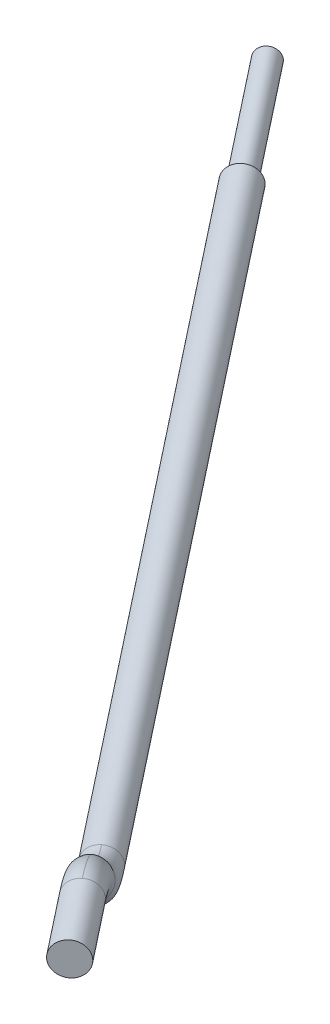
ISO-10303-21;
HEADER;
FILE_DESCRIPTION(('STEP AP214'),'2;1');
FILE_NAME('part.step','',(''),(''),'','','');
FILE_SCHEMA(('AUTOMOTIVE_DESIGN { 1 0 10303 214 1 1 1 1 }'));
ENDSEC;
DATA;
#1=APPLICATION_CONTEXT('core data for automotive mechanical design processes');
#2=APPLICATION_PROTOCOL_DEFINITION('international standard','automotive_design',2000,#1);
#3=PRODUCT_CONTEXT('',#1,'mechanical');
#4=PRODUCT('Part','Part','',(#3));
#5=PRODUCT_RELATED_PRODUCT_CATEGORY('part','',(#4));
#6=PRODUCT_DEFINITION_FORMATION('','',#4);
#7=PRODUCT_DEFINITION_CONTEXT('part definition',#1,'design');
#8=PRODUCT_DEFINITION('design','',#6,#7);
#9=PRODUCT_DEFINITION_SHAPE('','',#8);
#10=(LENGTH_UNIT() NAMED_UNIT(*) SI_UNIT(.MILLI.,.METRE.));
#11=(NAMED_UNIT(*) PLANE_ANGLE_UNIT() SI_UNIT($,.RADIAN.));
#12=(NAMED_UNIT(*) SI_UNIT($,.STERADIAN.) SOLID_ANGLE_UNIT());
#13=UNCERTAINTY_MEASURE_WITH_UNIT(LENGTH_MEASURE(1.E-05),#10,'distance_accuracy_value','');
#14=(GEOMETRIC_REPRESENTATION_CONTEXT(3) GLOBAL_UNCERTAINTY_ASSIGNED_CONTEXT((#13)) GLOBAL_UNIT_ASSIGNED_CONTEXT((#10,
#11,#12)) REPRESENTATION_CONTEXT('',''));
#15=CARTESIAN_POINT('',(0.,0.,0.));
#16=DIRECTION('',(0.,0.,1.));
#17=DIRECTION('',(1.,0.,0.));
#18=AXIS2_PLACEMENT_3D('',#15,#16,#17);
#19=CARTESIAN_POINT('',(111.992586777966,24.2617264619024,218.0470998851));
#20=DIRECTION('',(-0.618589574131749,0.,-0.78571428571428));
#21=DIRECTION('',(0.,1.,0.));
#22=AXIS2_PLACEMENT_3D('',#19,#20,#21);
#23=PLANE('',#22);
#24=CARTESIAN_POINT('',(111.992586777966,24.2617264619024,218.0470998851));
#25=DIRECTION('',(-0.618589574131749,0.,-0.78571428571428));
#26=DIRECTION('',(-0.78571428571428,0.,0.618589574131749));
#27=AXIS2_PLACEMENT_3D('',#24,#25,#26);
#28=CIRCLE('',#27,0.5715);
#29=CARTESIAN_POINT('',(112.441622492252,24.2617264619024,217.693575943483));
#30=VERTEX_POINT('',#29);
#31=CARTESIAN_POINT('',(111.54355106368,24.2617264619024,218.400623826716));
#32=VERTEX_POINT('',#31);
#33=EDGE_CURVE('E11',#30,#32,#28,.T.);
#34=ORIENTED_EDGE('',*,*,#33,.T.);
#35=CARTESIAN_POINT('',(111.992586777966,24.2617264619024,218.0470998851));
#36=DIRECTION('',(-0.618589574131749,0.,-0.78571428571428));
#37=DIRECTION('',(-0.78571428571428,0.,0.618589574131749));
#38=AXIS2_PLACEMENT_3D('',#35,#36,#37);
#39=CIRCLE('',#38,0.5715);
#40=EDGE_CURVE('E158',#32,#30,#39,.T.);
#41=ORIENTED_EDGE('',*,*,#40,.T.);
#42=EDGE_LOOP('',(#34,#41));
#43=FACE_BOUND('',#42,.T.);
#44=ADVANCED_FACE('F42',(#43),#23,.T.);
#45=CARTESIAN_POINT('',(111.992586777966,24.2617264619024,218.0470998851));
#46=DIRECTION('',(0.618589574131749,0.,0.78571428571428));
#47=DIRECTION('',(0.78571428571428,0.,-0.618589574131749));
#48=AXIS2_PLACEMENT_3D('',#45,#46,#47);
#49=CYLINDRICAL_SURFACE('',#48,0.5715);
#50=DIRECTION('',(0.618589574131749,0.,0.78571428571428));
#51=VECTOR('',#50,1.);
#52=CARTESIAN_POINT('',(111.54355106368,24.2617264619024,218.400623826716));
#53=LINE('',#52,#51);
#54=CARTESIAN_POINT('',(116.257203618564,24.2617264619024,224.387766683859));
#55=VERTEX_POINT('',#54);
#56=EDGE_CURVE('E152',#32,#55,#53,.T.);
#57=ORIENTED_EDGE('',*,*,#56,.F.);
#58=ORIENTED_EDGE('',*,*,#33,.F.);
#59=DIRECTION('',(0.618589574131749,0.,0.78571428571428));
#60=VECTOR('',#59,1.);
#61=CARTESIAN_POINT('',(112.441622492252,24.2617264619024,217.693575943483));
#62=LINE('',#61,#60);
#63=CARTESIAN_POINT('',(117.155275047136,24.2617264619024,223.680718800626));
#64=VERTEX_POINT('',#63);
#65=EDGE_CURVE('E143',#30,#64,#62,.T.);
#66=ORIENTED_EDGE('',*,*,#65,.T.);
#67=CARTESIAN_POINT('',(116.70623933285,24.2617264619024,224.034242742243));
#68=DIRECTION('',(-0.618589574131749,0.,-0.78571428571428));
#69=DIRECTION('',(-0.78571428571428,0.,0.618589574131749));
#70=AXIS2_PLACEMENT_3D('',#67,#68,#69);
#71=CIRCLE('',#70,0.5715);
#72=EDGE_CURVE('E53',#64,#55,#71,.T.);
#73=ORIENTED_EDGE('',*,*,#72,.T.);
#74=EDGE_LOOP('',(#57,#58,#66,#73));
#75=FACE_BOUND('',#74,.T.);
#76=ADVANCED_FACE('F144',(#75),#49,.T.);
#77=CARTESIAN_POINT('',(148.680515830146,26.8453,264.647028456528));
#78=DIRECTION('',(-0.618589574131749,0.,-0.78571428571428));
#79=DIRECTION('',(0.,1.,0.));
#80=AXIS2_PLACEMENT_3D('',#77,#78,#79);
#81=PLANE('',#80);
#82=CARTESIAN_POINT('',(148.680515830146,26.8453,264.647028456528));
#83=DIRECTION('',(-0.618589574131749,0.,-0.78571428571428));
#84=DIRECTION('',(-0.78571428571428,0.,0.618589574131749));
#85=AXIS2_PLACEMENT_3D('',#82,#83,#84);
#86=CIRCLE('',#85,0.8255);
#87=CARTESIAN_POINT('',(148.031908687289,26.8453,265.157674149974));
#88=VERTEX_POINT('',#87);
#89=CARTESIAN_POINT('',(149.329122973003,26.8453,264.136382763082));
#90=VERTEX_POINT('',#89);
#91=EDGE_CURVE('E233',#88,#90,#86,.T.);
#92=ORIENTED_EDGE('',*,*,#91,.F.);
#93=CARTESIAN_POINT('',(148.680515830146,26.8453,264.647028456528));
#94=DIRECTION('',(-0.618589574131749,0.,-0.78571428571428));
#95=DIRECTION('',(-0.78571428571428,0.,0.618589574131749));
#96=AXIS2_PLACEMENT_3D('',#93,#94,#95);
#97=CIRCLE('',#96,0.8255);
#98=EDGE_CURVE('E140',#90,#88,#97,.T.);
#99=ORIENTED_EDGE('',*,*,#98,.F.);
#100=EDGE_LOOP('',(#92,#99));
#101=FACE_BOUND('',#100,.T.);
#102=ADVANCED_FACE('F256',(#101),#81,.F.);
#103=CARTESIAN_POINT('',(116.70623933285,24.2617264619024,224.034242742243));
#104=DIRECTION('',(-0.618589574131749,0.,-0.78571428571428));
#105=DIRECTION('',(0.,1.,0.));
#106=AXIS2_PLACEMENT_3D('',#103,#104,#105);
#107=PLANE('',#106);
#108=ORIENTED_EDGE('',*,*,#72,.F.);
#109=CARTESIAN_POINT('',(116.70623933285,24.2617264619024,224.034242742243));
#110=DIRECTION('',(-0.618589574131749,0.,-0.78571428571428));
#111=DIRECTION('',(-0.78571428571428,0.,0.618589574131749));
#112=AXIS2_PLACEMENT_3D('',#109,#110,#111);
#113=CIRCLE('',#112,0.5715);
#114=EDGE_CURVE('E135',#55,#64,#113,.T.);
#115=ORIENTED_EDGE('',*,*,#114,.F.);
#116=EDGE_LOOP('',(#108,#115));
#117=FACE_BOUND('',#116,.T.);
#118=CARTESIAN_POINT('',(116.70623933285,24.2617264619024,224.034242742243));
#119=DIRECTION('',(-0.618589574131749,0.,-0.78571428571428));
#120=DIRECTION('',(-0.78571428571428,0.,0.618589574131749));
#121=AXIS2_PLACEMENT_3D('',#118,#119,#120);
#122=CIRCLE('',#121,0.8255);
#123=CARTESIAN_POINT('',(116.057632189993,24.2617264619024,224.544888435688));
#124=VERTEX_POINT('',#123);
#125=CARTESIAN_POINT('',(117.354846475707,24.2617264619024,223.523597048797));
#126=VERTEX_POINT('',#125);
#127=EDGE_CURVE('E167',#124,#126,#122,.T.);
#128=ORIENTED_EDGE('',*,*,#127,.T.);
#129=CARTESIAN_POINT('',(116.70623933285,24.2617264619024,224.034242742243));
#130=DIRECTION('',(-0.618589574131749,0.,-0.78571428571428));
#131=DIRECTION('',(-0.78571428571428,0.,0.618589574131749));
#132=AXIS2_PLACEMENT_3D('',#129,#130,#131);
#133=CIRCLE('',#132,0.8255);
#134=EDGE_CURVE('E203',#126,#124,#133,.T.);
#135=ORIENTED_EDGE('',*,*,#134,.T.);
#136=EDGE_LOOP('',(#128,#135));
#137=FACE_BOUND('',#136,.T.);
#138=ADVANCED_FACE('F132',(#117,#137),#107,.T.);
#139=CARTESIAN_POINT('',(148.680515830146,26.8453,264.647028456528));
#140=DIRECTION('',(-0.618589574131749,0.,-0.78571428571428));
#141=DIRECTION('',(-0.78571428571428,0.,0.618589574131749));
#142=AXIS2_PLACEMENT_3D('',#139,#140,#141);
#143=CYLINDRICAL_SURFACE('',#142,0.8255);
#144=DIRECTION('',(-0.618589574131749,0.,-0.78571428571428));
#145=VECTOR('',#144,1.);
#146=CARTESIAN_POINT('',(149.329122973003,26.8453,264.136382763082));
#147=LINE('',#146,#145);
#148=CARTESIAN_POINT('',(146.972296695561,26.8453,261.142811334511));
#149=VERTEX_POINT('',#148);
#150=EDGE_CURVE('E46',#90,#149,#147,.T.);
#151=ORIENTED_EDGE('',*,*,#150,.F.);
#152=ORIENTED_EDGE('',*,*,#98,.T.);
#153=DIRECTION('',(-0.618589574131749,0.,-0.78571428571428));
#154=VECTOR('',#153,1.);
#155=CARTESIAN_POINT('',(148.031908687289,26.8453,265.157674149974));
#156=LINE('',#155,#154);
#157=CARTESIAN_POINT('',(145.675082409847,26.8453,262.164102721402));
#158=VERTEX_POINT('',#157);
#159=EDGE_CURVE('E169',#88,#158,#156,.T.);
#160=ORIENTED_EDGE('',*,*,#159,.T.);
#161=CARTESIAN_POINT('',(146.323689552704,26.8453,261.653457027957));
#162=DIRECTION('',(-0.618589574131749,0.,-0.78571428571428));
#163=DIRECTION('',(-0.78571428571428,0.,0.618589574131749));
#164=AXIS2_PLACEMENT_3D('',#161,#162,#163);
#165=CIRCLE('',#164,0.8255);
#166=CARTESIAN_POINT('',(146.323689552704,26.0198,261.653457027957));
#167=VERTEX_POINT('',#166);
#168=EDGE_CURVE('E236',#167,#158,#165,.T.);
#169=ORIENTED_EDGE('',*,*,#168,.F.);
#170=CARTESIAN_POINT('',(146.323689552704,26.8453,261.653457027957));
#171=DIRECTION('',(-0.618589574131749,0.,-0.78571428571428));
#172=DIRECTION('',(-0.78571428571428,0.,0.618589574131749));
#173=AXIS2_PLACEMENT_3D('',#170,#171,#172);
#174=CIRCLE('',#173,0.8255);
#175=EDGE_CURVE('E65',#149,#167,#174,.T.);
#176=ORIENTED_EDGE('',*,*,#175,.F.);
#177=EDGE_LOOP('',(#151,#152,#160,#169,#176));
#178=FACE_BOUND('',#177,.T.);
#179=ADVANCED_FACE('F254',(#178),#143,.T.);
#180=CARTESIAN_POINT('',(146.323689552704,22.9893217548211,261.653457027957));
#181=DIRECTION('',(-0.78571428571428,0.,0.618589574131749));
#182=DIRECTION('',(0.618589574131749,0.,0.78571428571428));
#183=AXIS2_PLACEMENT_3D('',#180,#181,#182);
#184=TOROIDAL_SURFACE('',#183,3.85597824517889,0.8255);
#185=CARTESIAN_POINT('',(146.323689552704,22.9893217548211,261.653457027957));
#186=DIRECTION('',(-0.78571428571428,0.,0.618589574131749));
#187=DIRECTION('',(0.618589574131749,0.,0.78571428571428));
#188=AXIS2_PLACEMENT_3D('',#185,#186,#187);
#189=CIRCLE('',#188,4.68147824517889);
#190=CARTESIAN_POINT('',(146.323689552704,27.6708,261.653457027957));
#191=VERTEX_POINT('',#190);
#192=CARTESIAN_POINT('',(144.1608729183,26.1024634399395,258.906310942579));
#193=VERTEX_POINT('',#192);
#194=EDGE_CURVE('E188',#191,#193,#189,.T.);
#195=ORIENTED_EDGE('',*,*,#194,.F.);
#196=CARTESIAN_POINT('',(146.323689552704,26.8453,261.653457027957));
#197=DIRECTION('',(-0.618589574131749,0.,-0.78571428571428));
#198=DIRECTION('',(-0.78571428571428,0.,0.618589574131749));
#199=AXIS2_PLACEMENT_3D('',#196,#197,#198);
#200=CIRCLE('',#199,0.8255);
#201=EDGE_CURVE('E173',#191,#149,#200,.T.);
#202=ORIENTED_EDGE('',*,*,#201,.T.);
#203=ORIENTED_EDGE('',*,*,#175,.T.);
#204=CARTESIAN_POINT('',(146.323689552704,22.9893217548211,261.653457027957));
#205=DIRECTION('',(-0.78571428571428,0.,0.618589574131749));
#206=DIRECTION('',(0.618589574131749,0.,0.78571428571428));
#207=AXIS2_PLACEMENT_3D('',#204,#205,#206);
#208=CIRCLE('',#207,3.03047824517889);
#209=CARTESIAN_POINT('',(144.923625637931,25.0045630219629,259.875137016187));
#210=VERTEX_POINT('',#209);
#211=EDGE_CURVE('E240',#167,#210,#208,.T.);
#212=ORIENTED_EDGE('',*,*,#211,.T.);
#213=CARTESIAN_POINT('',(144.542249278115,25.5535132309512,259.390723979383));
#214=DIRECTION('',(-0.411356603267868,-0.746851221326742,-0.522493060385184));
#215=DIRECTION('',(-0.78571428571428,0.,0.618589574131749));
#216=AXIS2_PLACEMENT_3D('',#213,#214,#215);
#217=CIRCLE('',#216,0.8255);
#218=EDGE_CURVE('E227',#193,#210,#217,.T.);
#219=ORIENTED_EDGE('',*,*,#218,.F.);
#220=EDGE_LOOP('',(#195,#202,#203,#212,#219));
#221=FACE_BOUND('',#220,.T.);
#222=ADVANCED_FACE('F274',(#221),#184,.T.);
#223=CARTESIAN_POINT('',(142.760809003527,28.1177047070813,257.127990930809));
#224=DIRECTION('',(0.78571428571428,0.,-0.618589574131749));
#225=DIRECTION('',(-0.618589574131749,0.,-0.78571428571428));
#226=AXIS2_PLACEMENT_3D('',#223,#224,#225);
#227=TOROIDAL_SURFACE('',#226,3.85597824517889,0.8255);
#228=CARTESIAN_POINT('',(142.760809003527,28.1177047070813,257.127990930809));
#229=DIRECTION('',(0.78571428571428,0.,-0.618589574131749));
#230=DIRECTION('',(-0.618589574131749,0.,-0.78571428571428));
#231=AXIS2_PLACEMENT_3D('',#228,#229,#230);
#232=CIRCLE('',#231,4.68147824517889);
#233=CARTESIAN_POINT('',(142.760809003527,23.4362264619024,257.127990930809));
#234=VERTEX_POINT('',#233);
#235=EDGE_CURVE('E200',#210,#234,#232,.T.);
#236=ORIENTED_EDGE('',*,*,#235,.F.);
#237=CARTESIAN_POINT('',(144.542249278115,25.5535132309512,259.390723979383));
#238=DIRECTION('',(-0.411356603267868,-0.746851221326742,-0.522493060385184));
#239=DIRECTION('',(-0.78571428571428,0.,0.618589574131749));
#240=AXIS2_PLACEMENT_3D('',#237,#238,#239);
#241=CIRCLE('',#240,0.8255);
#242=EDGE_CURVE('E161',#210,#193,#241,.T.);
#243=ORIENTED_EDGE('',*,*,#242,.T.);
#244=CARTESIAN_POINT('',(142.760809003527,28.1177047070813,257.127990930809));
#245=DIRECTION('',(0.78571428571428,0.,-0.618589574131749));
#246=DIRECTION('',(-0.618589574131749,0.,-0.78571428571428));
#247=AXIS2_PLACEMENT_3D('',#244,#245,#246);
#248=CIRCLE('',#247,3.03047824517889);
#249=CARTESIAN_POINT('',(142.760809003527,25.0872264619024,257.127990930809));
#250=VERTEX_POINT('',#249);
#251=EDGE_CURVE('E175',#193,#250,#248,.T.);
#252=ORIENTED_EDGE('',*,*,#251,.T.);
#253=CARTESIAN_POINT('',(142.760809003527,24.2617264619024,257.127990930809));
#254=DIRECTION('',(-0.618589574131749,0.,-0.78571428571428));
#255=DIRECTION('',(-0.78571428571428,0.,0.618589574131749));
#256=AXIS2_PLACEMENT_3D('',#253,#254,#255);
#257=CIRCLE('',#256,0.8255);
#258=CARTESIAN_POINT('',(142.11220186067,24.2617264619024,257.638636624255));
#259=VERTEX_POINT('',#258);
#260=EDGE_CURVE('E149',#259,#250,#257,.T.);
#261=ORIENTED_EDGE('',*,*,#260,.F.);
#262=CARTESIAN_POINT('',(142.760809003527,24.2617264619024,257.127990930809));
#263=DIRECTION('',(-0.618589574131749,0.,-0.78571428571428));
#264=DIRECTION('',(-0.78571428571428,0.,0.618589574131749));
#265=AXIS2_PLACEMENT_3D('',#262,#263,#264);
#266=CIRCLE('',#265,0.8255);
#267=EDGE_CURVE('E172',#234,#259,#266,.T.);
#268=ORIENTED_EDGE('',*,*,#267,.F.);
#269=EDGE_LOOP('',(#236,#243,#252,#261,#268));
#270=FACE_BOUND('',#269,.T.);
#271=ADVANCED_FACE('F271',(#270),#227,.T.);
#272=CARTESIAN_POINT('',(142.760809003527,24.2617264619024,257.127990930809));
#273=DIRECTION('',(-0.618589574131749,0.,-0.78571428571428));
#274=DIRECTION('',(-0.78571428571428,0.,0.618589574131749));
#275=AXIS2_PLACEMENT_3D('',#272,#273,#274);
#276=CYLINDRICAL_SURFACE('',#275,0.8255);
#277=DIRECTION('',(-0.618589574131749,0.,-0.78571428571428));
#278=VECTOR('',#277,1.);
#279=CARTESIAN_POINT('',(143.409416146384,24.2617264619024,256.617345237363));
#280=LINE('',#279,#278);
#281=CARTESIAN_POINT('',(143.409416146384,24.2617264619024,256.617345237363));
#282=VERTEX_POINT('',#281);
#283=EDGE_CURVE('E164',#282,#126,#280,.T.);
#284=ORIENTED_EDGE('',*,*,#283,.F.);
#285=CARTESIAN_POINT('',(142.760809003527,24.2617264619024,257.127990930809));
#286=DIRECTION('',(-0.618589574131749,0.,-0.78571428571428));
#287=DIRECTION('',(-0.78571428571428,0.,0.618589574131749));
#288=AXIS2_PLACEMENT_3D('',#285,#286,#287);
#289=CIRCLE('',#288,0.8255);
#290=EDGE_CURVE('E192',#282,#234,#289,.T.);
#291=ORIENTED_EDGE('',*,*,#290,.T.);
#292=ORIENTED_EDGE('',*,*,#267,.T.);
#293=DIRECTION('',(-0.618589574131749,0.,-0.78571428571428));
#294=VECTOR('',#293,1.);
#295=CARTESIAN_POINT('',(142.11220186067,24.2617264619024,257.638636624255));
#296=LINE('',#295,#294);
#297=EDGE_CURVE('E220',#259,#124,#296,.T.);
#298=ORIENTED_EDGE('',*,*,#297,.T.);
#299=ORIENTED_EDGE('',*,*,#134,.F.);
#300=EDGE_LOOP('',(#284,#291,#292,#298,#299));
#301=FACE_BOUND('',#300,.T.);
#302=ADVANCED_FACE('F273',(#301),#276,.T.);
#303=CARTESIAN_POINT('',(148.680515830146,26.8453,264.647028456528));
#304=DIRECTION('',(-0.618589574131749,0.,-0.78571428571428));
#305=DIRECTION('',(-0.78571428571428,0.,0.618589574131749));
#306=AXIS2_PLACEMENT_3D('',#303,#304,#305);
#307=CYLINDRICAL_SURFACE('',#306,0.8255);
#308=ORIENTED_EDGE('',*,*,#91,.T.);
#309=ORIENTED_EDGE('',*,*,#150,.T.);
#310=ORIENTED_EDGE('',*,*,#201,.F.);
#311=CARTESIAN_POINT('',(146.323689552704,26.8453,261.653457027957));
#312=DIRECTION('',(-0.618589574131749,0.,-0.78571428571428));
#313=DIRECTION('',(-0.78571428571428,0.,0.618589574131749));
#314=AXIS2_PLACEMENT_3D('',#311,#312,#313);
#315=CIRCLE('',#314,0.8255);
#316=EDGE_CURVE('E178',#158,#191,#315,.T.);
#317=ORIENTED_EDGE('',*,*,#316,.F.);
#318=ORIENTED_EDGE('',*,*,#159,.F.);
#319=EDGE_LOOP('',(#308,#309,#310,#317,#318));
#320=FACE_BOUND('',#319,.T.);
#321=ADVANCED_FACE('F251',(#320),#307,.T.);
#322=CARTESIAN_POINT('',(142.760809003527,24.2617264619024,257.127990930809));
#323=DIRECTION('',(-0.618589574131749,0.,-0.78571428571428));
#324=DIRECTION('',(-0.78571428571428,0.,0.618589574131749));
#325=AXIS2_PLACEMENT_3D('',#322,#323,#324);
#326=CYLINDRICAL_SURFACE('',#325,0.8255);
#327=ORIENTED_EDGE('',*,*,#260,.T.);
#328=CARTESIAN_POINT('',(142.760809003527,24.2617264619024,257.127990930809));
#329=DIRECTION('',(-0.618589574131749,0.,-0.78571428571428));
#330=DIRECTION('',(-0.78571428571428,0.,0.618589574131749));
#331=AXIS2_PLACEMENT_3D('',#328,#329,#330);
#332=CIRCLE('',#331,0.8255);
#333=EDGE_CURVE('E179',#250,#282,#332,.T.);
#334=ORIENTED_EDGE('',*,*,#333,.T.);
#335=ORIENTED_EDGE('',*,*,#283,.T.);
#336=ORIENTED_EDGE('',*,*,#127,.F.);
#337=ORIENTED_EDGE('',*,*,#297,.F.);
#338=EDGE_LOOP('',(#327,#334,#335,#336,#337));
#339=FACE_BOUND('',#338,.T.);
#340=ADVANCED_FACE('F298',(#339),#326,.T.);
#341=CARTESIAN_POINT('',(111.992586777966,24.2617264619024,218.0470998851));
#342=DIRECTION('',(0.618589574131749,0.,0.78571428571428));
#343=DIRECTION('',(0.78571428571428,0.,-0.618589574131749));
#344=AXIS2_PLACEMENT_3D('',#341,#342,#343);
#345=CYLINDRICAL_SURFACE('',#344,0.5715);
#346=ORIENTED_EDGE('',*,*,#40,.F.);
#347=ORIENTED_EDGE('',*,*,#56,.T.);
#348=ORIENTED_EDGE('',*,*,#114,.T.);
#349=ORIENTED_EDGE('',*,*,#65,.F.);
#350=EDGE_LOOP('',(#346,#347,#348,#349));
#351=FACE_BOUND('',#350,.T.);
#352=ADVANCED_FACE('F151',(#351),#345,.T.);
#353=CARTESIAN_POINT('',(146.323689552704,22.9893217548211,261.653457027957));
#354=DIRECTION('',(-0.78571428571428,0.,0.618589574131749));
#355=DIRECTION('',(0.618589574131749,0.,0.78571428571428));
#356=AXIS2_PLACEMENT_3D('',#353,#354,#355);
#357=TOROIDAL_SURFACE('',#356,3.85597824517889,0.8255);
#358=ORIENTED_EDGE('',*,*,#316,.T.);
#359=ORIENTED_EDGE('',*,*,#194,.T.);
#360=ORIENTED_EDGE('',*,*,#242,.F.);
#361=ORIENTED_EDGE('',*,*,#211,.F.);
#362=ORIENTED_EDGE('',*,*,#168,.T.);
#363=EDGE_LOOP('',(#358,#359,#360,#361,#362));
#364=FACE_BOUND('',#363,.T.);
#365=ADVANCED_FACE('F44',(#364),#357,.T.);
#366=CARTESIAN_POINT('',(142.760809003527,28.1177047070813,257.127990930809));
#367=DIRECTION('',(0.78571428571428,0.,-0.618589574131749));
#368=DIRECTION('',(-0.618589574131749,0.,-0.78571428571428));
#369=AXIS2_PLACEMENT_3D('',#366,#367,#368);
#370=TOROIDAL_SURFACE('',#369,3.85597824517889,0.8255);
#371=ORIENTED_EDGE('',*,*,#218,.T.);
#372=ORIENTED_EDGE('',*,*,#235,.T.);
#373=ORIENTED_EDGE('',*,*,#290,.F.);
#374=ORIENTED_EDGE('',*,*,#333,.F.);
#375=ORIENTED_EDGE('',*,*,#251,.F.);
#376=EDGE_LOOP('',(#371,#372,#373,#374,#375));
#377=FACE_BOUND('',#376,.T.);
#378=ADVANCED_FACE('F286',(#377),#370,.T.);
#379=CLOSED_SHELL('',(#44,#76,#102,#138,#179,#222,#271,#302,#321,#340,#352,#365,#378));
#380=MANIFOLD_SOLID_BREP('B2',#379);
#381=ADVANCED_BREP_SHAPE_REPRESENTATION('',(#18,#380),#14);
#382=SHAPE_DEFINITION_REPRESENTATION(#9,#381);
ENDSEC;
END-ISO-10303-21;
